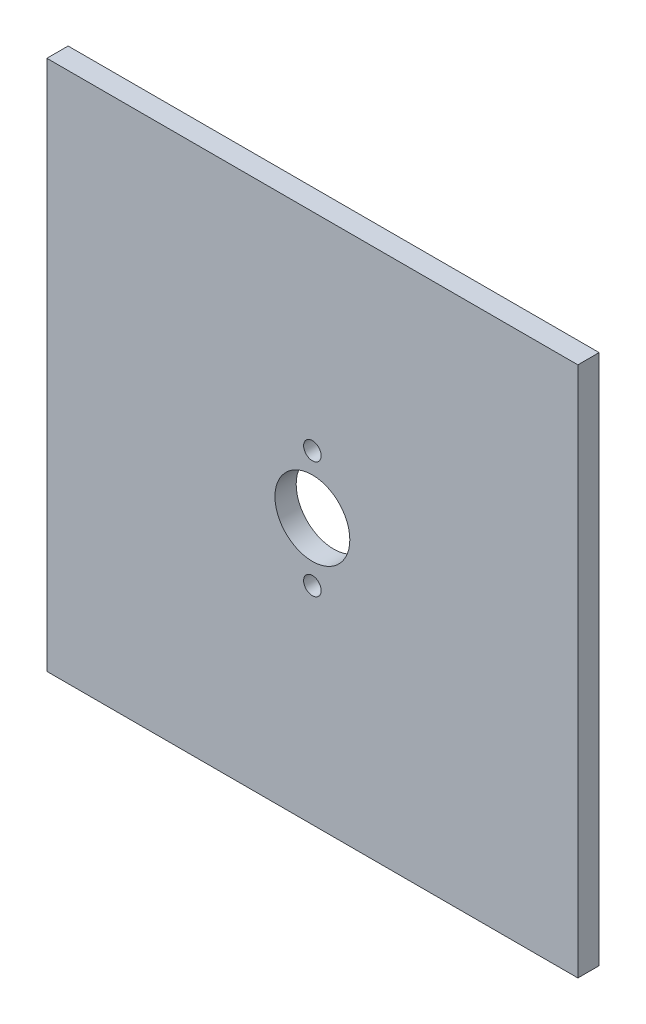
ISO-10303-21;
HEADER;
FILE_DESCRIPTION(('STEP AP214'),'2;1');
FILE_NAME('part.step','',(''),(''),'','','');
FILE_SCHEMA(('AUTOMOTIVE_DESIGN { 1 0 10303 214 1 1 1 1 }'));
ENDSEC;
DATA;
#1=APPLICATION_CONTEXT('core data for automotive mechanical design processes');
#2=APPLICATION_PROTOCOL_DEFINITION('international standard','automotive_design',2000,#1);
#3=PRODUCT_CONTEXT('',#1,'mechanical');
#4=PRODUCT('Part','Part','',(#3));
#5=PRODUCT_RELATED_PRODUCT_CATEGORY('part','',(#4));
#6=PRODUCT_DEFINITION_FORMATION('','',#4);
#7=PRODUCT_DEFINITION_CONTEXT('part definition',#1,'design');
#8=PRODUCT_DEFINITION('design','',#6,#7);
#9=PRODUCT_DEFINITION_SHAPE('','',#8);
#10=(LENGTH_UNIT() NAMED_UNIT(*) SI_UNIT(.MILLI.,.METRE.));
#11=(NAMED_UNIT(*) PLANE_ANGLE_UNIT() SI_UNIT($,.RADIAN.));
#12=(NAMED_UNIT(*) SI_UNIT($,.STERADIAN.) SOLID_ANGLE_UNIT());
#13=UNCERTAINTY_MEASURE_WITH_UNIT(LENGTH_MEASURE(1.E-05),#10,'distance_accuracy_value','');
#14=(GEOMETRIC_REPRESENTATION_CONTEXT(3) GLOBAL_UNCERTAINTY_ASSIGNED_CONTEXT((#13)) GLOBAL_UNIT_ASSIGNED_CONTEXT((#10,
#11,#12)) REPRESENTATION_CONTEXT('',''));
#15=CARTESIAN_POINT('',(0.,0.,0.));
#16=DIRECTION('',(0.,0.,1.));
#17=DIRECTION('',(1.,0.,0.));
#18=AXIS2_PLACEMENT_3D('',#15,#16,#17);
#19=CARTESIAN_POINT('',(0.,0.,2.));
#20=DIRECTION('',(-1.,0.,0.));
#21=DIRECTION('',(0.,0.,1.));
#22=AXIS2_PLACEMENT_3D('',#19,#20,#21);
#23=PLANE('',#22);
#24=DIRECTION('',(0.,1.,0.));
#25=VECTOR('',#24,1.);
#26=CARTESIAN_POINT('',(0.,0.,0.));
#27=LINE('',#26,#25);
#28=CARTESIAN_POINT('',(0.,0.,0.));
#29=VERTEX_POINT('',#28);
#30=CARTESIAN_POINT('',(0.,50.,0.));
#31=VERTEX_POINT('',#30);
#32=EDGE_CURVE('E98',#29,#31,#27,.T.);
#33=ORIENTED_EDGE('',*,*,#32,.T.);
#34=DIRECTION('',(0.,0.,-1.));
#35=VECTOR('',#34,1.);
#36=CARTESIAN_POINT('',(0.,50.,2.));
#37=LINE('',#36,#35);
#38=CARTESIAN_POINT('',(0.,50.,2.));
#39=VERTEX_POINT('',#38);
#40=EDGE_CURVE('E11',#39,#31,#37,.T.);
#41=ORIENTED_EDGE('',*,*,#40,.F.);
#42=DIRECTION('',(0.,1.,0.));
#43=VECTOR('',#42,1.);
#44=CARTESIAN_POINT('',(0.,0.,2.));
#45=LINE('',#44,#43);
#46=CARTESIAN_POINT('',(0.,0.,2.));
#47=VERTEX_POINT('',#46);
#48=EDGE_CURVE('E86',#47,#39,#45,.T.);
#49=ORIENTED_EDGE('',*,*,#48,.F.);
#50=DIRECTION('',(0.,0.,-1.));
#51=VECTOR('',#50,1.);
#52=CARTESIAN_POINT('',(0.,0.,2.));
#53=LINE('',#52,#51);
#54=EDGE_CURVE('E94',#47,#29,#53,.T.);
#55=ORIENTED_EDGE('',*,*,#54,.T.);
#56=EDGE_LOOP('',(#33,#41,#49,#55));
#57=FACE_BOUND('',#56,.T.);
#58=ADVANCED_FACE('F35',(#57),#23,.F.);
#59=CARTESIAN_POINT('',(0.,50.,2.));
#60=DIRECTION('',(0.,-1.,0.));
#61=DIRECTION('',(1.,0.,0.));
#62=AXIS2_PLACEMENT_3D('',#59,#60,#61);
#63=PLANE('',#62);
#64=DIRECTION('',(-1.,0.,0.));
#65=VECTOR('',#64,1.);
#66=CARTESIAN_POINT('',(0.,50.,0.));
#67=LINE('',#66,#65);
#68=CARTESIAN_POINT('',(-50.,50.,0.));
#69=VERTEX_POINT('',#68);
#70=EDGE_CURVE('E90',#31,#69,#67,.T.);
#71=ORIENTED_EDGE('',*,*,#70,.T.);
#72=DIRECTION('',(0.,0.,-1.));
#73=VECTOR('',#72,1.);
#74=CARTESIAN_POINT('',(-50.,50.,2.));
#75=LINE('',#74,#73);
#76=CARTESIAN_POINT('',(-50.,50.,2.));
#77=VERTEX_POINT('',#76);
#78=EDGE_CURVE('E43',#77,#69,#75,.T.);
#79=ORIENTED_EDGE('',*,*,#78,.F.);
#80=DIRECTION('',(-1.,0.,0.));
#81=VECTOR('',#80,1.);
#82=CARTESIAN_POINT('',(0.,50.,2.));
#83=LINE('',#82,#81);
#84=EDGE_CURVE('E81',#39,#77,#83,.T.);
#85=ORIENTED_EDGE('',*,*,#84,.F.);
#86=ORIENTED_EDGE('',*,*,#40,.T.);
#87=EDGE_LOOP('',(#71,#79,#85,#86));
#88=FACE_BOUND('',#87,.T.);
#89=ADVANCED_FACE('F89',(#88),#63,.F.);
#90=CARTESIAN_POINT('',(-50.,0.,2.));
#91=DIRECTION('',(1.,0.,0.));
#92=DIRECTION('',(0.,0.,-1.));
#93=AXIS2_PLACEMENT_3D('',#90,#91,#92);
#94=PLANE('',#93);
#95=DIRECTION('',(0.,-1.,0.));
#96=VECTOR('',#95,1.);
#97=CARTESIAN_POINT('',(-50.,0.,0.));
#98=LINE('',#97,#96);
#99=CARTESIAN_POINT('',(-50.,0.,0.));
#100=VERTEX_POINT('',#99);
#101=EDGE_CURVE('E68',#69,#100,#98,.T.);
#102=ORIENTED_EDGE('',*,*,#101,.T.);
#103=DIRECTION('',(0.,0.,-1.));
#104=VECTOR('',#103,1.);
#105=CARTESIAN_POINT('',(-50.,0.,2.));
#106=LINE('',#105,#104);
#107=CARTESIAN_POINT('',(-50.,0.,2.));
#108=VERTEX_POINT('',#107);
#109=EDGE_CURVE('E91',#108,#100,#106,.T.);
#110=ORIENTED_EDGE('',*,*,#109,.F.);
#111=DIRECTION('',(0.,-1.,0.));
#112=VECTOR('',#111,1.);
#113=CARTESIAN_POINT('',(-50.,0.,2.));
#114=LINE('',#113,#112);
#115=EDGE_CURVE('E84',#77,#108,#114,.T.);
#116=ORIENTED_EDGE('',*,*,#115,.F.);
#117=ORIENTED_EDGE('',*,*,#78,.T.);
#118=EDGE_LOOP('',(#102,#110,#116,#117));
#119=FACE_BOUND('',#118,.T.);
#120=ADVANCED_FACE('F92',(#119),#94,.F.);
#121=CARTESIAN_POINT('',(0.,0.,2.));
#122=DIRECTION('',(0.,1.,0.));
#123=DIRECTION('',(0.,0.,1.));
#124=AXIS2_PLACEMENT_3D('',#121,#122,#123);
#125=PLANE('',#124);
#126=DIRECTION('',(1.,0.,0.));
#127=VECTOR('',#126,1.);
#128=CARTESIAN_POINT('',(0.,0.,0.));
#129=LINE('',#128,#127);
#130=EDGE_CURVE('E74',#100,#29,#129,.T.);
#131=ORIENTED_EDGE('',*,*,#130,.T.);
#132=ORIENTED_EDGE('',*,*,#54,.F.);
#133=DIRECTION('',(1.,0.,0.));
#134=VECTOR('',#133,1.);
#135=CARTESIAN_POINT('',(0.,0.,2.));
#136=LINE('',#135,#134);
#137=EDGE_CURVE('E51',#108,#47,#136,.T.);
#138=ORIENTED_EDGE('',*,*,#137,.F.);
#139=ORIENTED_EDGE('',*,*,#109,.T.);
#140=EDGE_LOOP('',(#131,#132,#138,#139));
#141=FACE_BOUND('',#140,.T.);
#142=ADVANCED_FACE('F106',(#141),#125,.F.);
#143=CARTESIAN_POINT('',(0.,0.,2.));
#144=DIRECTION('',(0.,0.,1.));
#145=DIRECTION('',(1.,0.,0.));
#146=AXIS2_PLACEMENT_3D('',#143,#144,#145);
#147=PLANE('',#146);
#148=CARTESIAN_POINT('',(-25.,25.,2.));
#149=DIRECTION('',(0.,0.,1.));
#150=DIRECTION('',(1.,0.,0.));
#151=AXIS2_PLACEMENT_3D('',#148,#149,#150);
#152=CIRCLE('',#151,3.525);
#153=CARTESIAN_POINT('',(-21.475,25.,2.));
#154=VERTEX_POINT('',#153);
#155=EDGE_CURVE('E124',#154,#154,#152,.F.);
#156=ORIENTED_EDGE('',*,*,#155,.T.);
#157=EDGE_LOOP('',(#156));
#158=FACE_BOUND('',#157,.T.);
#159=CARTESIAN_POINT('',(-25.,30.5,2.));
#160=DIRECTION('',(0.,0.,1.));
#161=DIRECTION('',(1.,0.,0.));
#162=AXIS2_PLACEMENT_3D('',#159,#160,#161);
#163=CIRCLE('',#162,0.825000000000001);
#164=CARTESIAN_POINT('',(-24.175,30.5,2.));
#165=VERTEX_POINT('',#164);
#166=EDGE_CURVE('E115',#165,#165,#163,.T.);
#167=ORIENTED_EDGE('',*,*,#166,.F.);
#168=EDGE_LOOP('',(#167));
#169=FACE_BOUND('',#168,.T.);
#170=CARTESIAN_POINT('',(-25.,19.5,2.));
#171=DIRECTION('',(0.,0.,1.));
#172=DIRECTION('',(1.,0.,0.));
#173=AXIS2_PLACEMENT_3D('',#170,#171,#172);
#174=CIRCLE('',#173,0.825000000000001);
#175=CARTESIAN_POINT('',(-24.175,19.5,2.));
#176=VERTEX_POINT('',#175);
#177=EDGE_CURVE('E116',#176,#176,#174,.T.);
#178=ORIENTED_EDGE('',*,*,#177,.F.);
#179=EDGE_LOOP('',(#178));
#180=FACE_BOUND('',#179,.T.);
#181=ORIENTED_EDGE('',*,*,#48,.T.);
#182=ORIENTED_EDGE('',*,*,#84,.T.);
#183=ORIENTED_EDGE('',*,*,#115,.T.);
#184=ORIENTED_EDGE('',*,*,#137,.T.);
#185=EDGE_LOOP('',(#181,#182,#183,#184));
#186=FACE_BOUND('',#185,.T.);
#187=ADVANCED_FACE('F82',(#158,#169,#180,#186),#147,.T.);
#188=CARTESIAN_POINT('',(0.,0.,0.));
#189=DIRECTION('',(0.,0.,1.));
#190=DIRECTION('',(1.,0.,0.));
#191=AXIS2_PLACEMENT_3D('',#188,#189,#190);
#192=PLANE('',#191);
#193=CARTESIAN_POINT('',(-25.,25.,0.));
#194=DIRECTION('',(0.,0.,-1.));
#195=DIRECTION('',(-1.,0.,0.));
#196=AXIS2_PLACEMENT_3D('',#193,#194,#195);
#197=CIRCLE('',#196,3.525);
#198=CARTESIAN_POINT('',(-28.525,25.,0.));
#199=VERTEX_POINT('',#198);
#200=EDGE_CURVE('E119',#199,#199,#197,.T.);
#201=ORIENTED_EDGE('',*,*,#200,.F.);
#202=EDGE_LOOP('',(#201));
#203=FACE_BOUND('',#202,.T.);
#204=CARTESIAN_POINT('',(-25.,30.5,0.));
#205=DIRECTION('',(0.,0.,1.));
#206=DIRECTION('',(1.,0.,0.));
#207=AXIS2_PLACEMENT_3D('',#204,#205,#206);
#208=CIRCLE('',#207,0.825000000000001);
#209=CARTESIAN_POINT('',(-24.175,30.5,0.));
#210=VERTEX_POINT('',#209);
#211=EDGE_CURVE('E101',#210,#210,#208,.F.);
#212=ORIENTED_EDGE('',*,*,#211,.F.);
#213=EDGE_LOOP('',(#212));
#214=FACE_BOUND('',#213,.T.);
#215=CARTESIAN_POINT('',(-25.,19.5,0.));
#216=DIRECTION('',(0.,0.,1.));
#217=DIRECTION('',(1.,0.,0.));
#218=AXIS2_PLACEMENT_3D('',#215,#216,#217);
#219=CIRCLE('',#218,0.825000000000001);
#220=CARTESIAN_POINT('',(-24.175,19.5,0.));
#221=VERTEX_POINT('',#220);
#222=EDGE_CURVE('E112',#221,#221,#219,.F.);
#223=ORIENTED_EDGE('',*,*,#222,.F.);
#224=EDGE_LOOP('',(#223));
#225=FACE_BOUND('',#224,.T.);
#226=ORIENTED_EDGE('',*,*,#32,.F.);
#227=ORIENTED_EDGE('',*,*,#130,.F.);
#228=ORIENTED_EDGE('',*,*,#101,.F.);
#229=ORIENTED_EDGE('',*,*,#70,.F.);
#230=EDGE_LOOP('',(#226,#227,#228,#229));
#231=FACE_BOUND('',#230,.T.);
#232=ADVANCED_FACE('F109',(#203,#214,#225,#231),#192,.F.);
#233=CARTESIAN_POINT('',(-25.,19.5,-0.00100000000000013));
#234=DIRECTION('',(0.,0.,1.));
#235=DIRECTION('',(1.,0.,0.));
#236=AXIS2_PLACEMENT_3D('',#233,#234,#235);
#237=CYLINDRICAL_SURFACE('',#236,0.825000000000001);
#238=ORIENTED_EDGE('',*,*,#177,.T.);
#239=EDGE_LOOP('',(#238));
#240=FACE_BOUND('',#239,.T.);
#241=ORIENTED_EDGE('',*,*,#222,.T.);
#242=EDGE_LOOP('',(#241));
#243=FACE_BOUND('',#242,.T.);
#244=ADVANCED_FACE('F134',(#240,#243),#237,.F.);
#245=CARTESIAN_POINT('',(-25.,30.5,-0.00100000000000013));
#246=DIRECTION('',(0.,0.,1.));
#247=DIRECTION('',(1.,0.,0.));
#248=AXIS2_PLACEMENT_3D('',#245,#246,#247);
#249=CYLINDRICAL_SURFACE('',#248,0.825000000000001);
#250=ORIENTED_EDGE('',*,*,#166,.T.);
#251=EDGE_LOOP('',(#250));
#252=FACE_BOUND('',#251,.T.);
#253=ORIENTED_EDGE('',*,*,#211,.T.);
#254=EDGE_LOOP('',(#253));
#255=FACE_BOUND('',#254,.T.);
#256=ADVANCED_FACE('F141',(#252,#255),#249,.F.);
#257=CARTESIAN_POINT('',(-25.,25.,2.001));
#258=DIRECTION('',(0.,0.,-1.));
#259=DIRECTION('',(-1.,0.,0.));
#260=AXIS2_PLACEMENT_3D('',#257,#258,#259);
#261=CYLINDRICAL_SURFACE('',#260,3.525);
#262=ORIENTED_EDGE('',*,*,#155,.F.);
#263=EDGE_LOOP('',(#262));
#264=FACE_BOUND('',#263,.T.);
#265=ORIENTED_EDGE('',*,*,#200,.T.);
#266=EDGE_LOOP('',(#265));
#267=FACE_BOUND('',#266,.T.);
#268=ADVANCED_FACE('F130',(#264,#267),#261,.F.);
#269=CLOSED_SHELL('',(#58,#89,#120,#142,#187,#232,#244,#256,#268));
#270=MANIFOLD_SOLID_BREP('B2',#269);
#271=ADVANCED_BREP_SHAPE_REPRESENTATION('',(#18,#270),#14);
#272=SHAPE_DEFINITION_REPRESENTATION(#9,#271);
ENDSEC;
END-ISO-10303-21;
